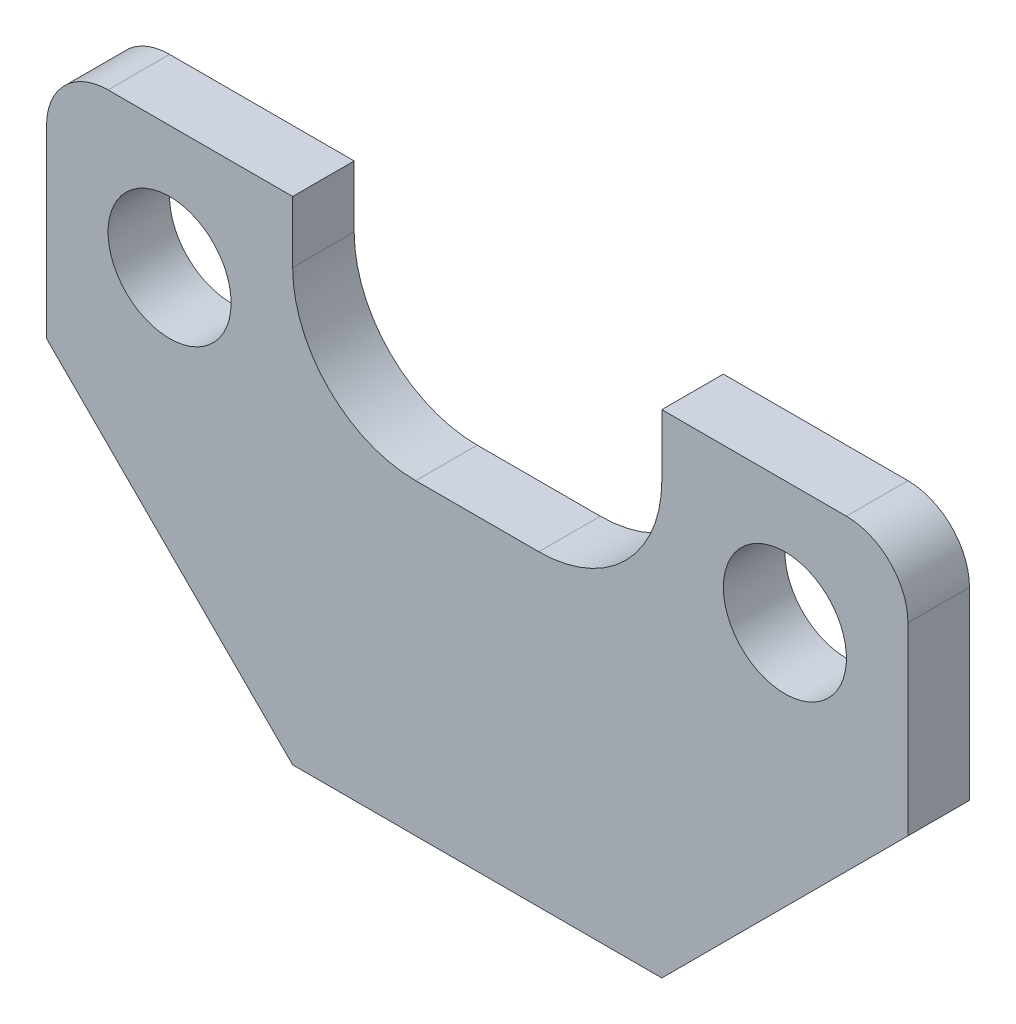
ISO-10303-21;
HEADER;
FILE_DESCRIPTION(('STEP AP214'),'2;1');
FILE_NAME('part.step','',(''),(''),'','','');
FILE_SCHEMA(('AUTOMOTIVE_DESIGN { 1 0 10303 214 1 1 1 1 }'));
ENDSEC;
DATA;
#1=APPLICATION_CONTEXT('core data for automotive mechanical design processes');
#2=APPLICATION_PROTOCOL_DEFINITION('international standard','automotive_design',2000,#1);
#3=PRODUCT_CONTEXT('',#1,'mechanical');
#4=PRODUCT('Part','Part','',(#3));
#5=PRODUCT_RELATED_PRODUCT_CATEGORY('part','',(#4));
#6=PRODUCT_DEFINITION_FORMATION('','',#4);
#7=PRODUCT_DEFINITION_CONTEXT('part definition',#1,'design');
#8=PRODUCT_DEFINITION('design','',#6,#7);
#9=PRODUCT_DEFINITION_SHAPE('','',#8);
#10=(LENGTH_UNIT() NAMED_UNIT(*) SI_UNIT(.MILLI.,.METRE.));
#11=(NAMED_UNIT(*) PLANE_ANGLE_UNIT() SI_UNIT($,.RADIAN.));
#12=(NAMED_UNIT(*) SI_UNIT($,.STERADIAN.) SOLID_ANGLE_UNIT());
#13=UNCERTAINTY_MEASURE_WITH_UNIT(LENGTH_MEASURE(1.E-05),#10,'distance_accuracy_value','');
#14=(GEOMETRIC_REPRESENTATION_CONTEXT(3) GLOBAL_UNCERTAINTY_ASSIGNED_CONTEXT((#13)) GLOBAL_UNIT_ASSIGNED_CONTEXT((#10,
#11,#12)) REPRESENTATION_CONTEXT('',''));
#15=CARTESIAN_POINT('',(0.,0.,0.));
#16=DIRECTION('',(0.,0.,1.));
#17=DIRECTION('',(1.,0.,0.));
#18=AXIS2_PLACEMENT_3D('',#15,#16,#17);
#19=CARTESIAN_POINT('',(-30.,35.,5.));
#20=DIRECTION('',(0.,0.,1.));
#21=DIRECTION('',(1.,0.,0.));
#22=AXIS2_PLACEMENT_3D('',#19,#20,#21);
#23=PLANE('',#22);
#24=CARTESIAN_POINT('',(-25.,30.,5.));
#25=DIRECTION('',(0.,0.,1.));
#26=DIRECTION('',(1.,0.,0.));
#27=AXIS2_PLACEMENT_3D('',#24,#25,#26);
#28=CIRCLE('',#27,5.);
#29=CARTESIAN_POINT('',(-20.,30.,5.));
#30=VERTEX_POINT('',#29);
#31=EDGE_CURVE('E174',#30,#30,#28,.T.);
#32=ORIENTED_EDGE('',*,*,#31,.F.);
#33=EDGE_LOOP('',(#32));
#34=FACE_BOUND('',#33,.T.);
#35=DIRECTION('',(0.707106781186548,-0.707106781186547,0.));
#36=VECTOR('',#35,1.);
#37=CARTESIAN_POINT('',(-15.,0.,5.));
#38=LINE('',#37,#36);
#39=CARTESIAN_POINT('',(-35.,20.,5.));
#40=VERTEX_POINT('',#39);
#41=CARTESIAN_POINT('',(-15.,0.,5.));
#42=VERTEX_POINT('',#41);
#43=EDGE_CURVE('E197',#40,#42,#38,.T.);
#44=ORIENTED_EDGE('',*,*,#43,.T.);
#45=DIRECTION('',(1.,0.,0.));
#46=VECTOR('',#45,1.);
#47=CARTESIAN_POINT('',(15.,0.,5.));
#48=LINE('',#47,#46);
#49=CARTESIAN_POINT('',(15.,0.,5.));
#50=VERTEX_POINT('',#49);
#51=EDGE_CURVE('E115',#42,#50,#48,.T.);
#52=ORIENTED_EDGE('',*,*,#51,.T.);
#53=DIRECTION('',(0.707106781186548,0.707106781186547,0.));
#54=VECTOR('',#53,1.);
#55=CARTESIAN_POINT('',(15.,0.,5.));
#56=LINE('',#55,#54);
#57=CARTESIAN_POINT('',(35.,20.,5.));
#58=VERTEX_POINT('',#57);
#59=EDGE_CURVE('E230',#50,#58,#56,.T.);
#60=ORIENTED_EDGE('',*,*,#59,.T.);
#61=DIRECTION('',(0.,1.,0.));
#62=VECTOR('',#61,1.);
#63=CARTESIAN_POINT('',(35.,20.,5.));
#64=LINE('',#63,#62);
#65=CARTESIAN_POINT('',(35.,35.,5.));
#66=VERTEX_POINT('',#65);
#67=EDGE_CURVE('E249',#58,#66,#64,.T.);
#68=ORIENTED_EDGE('',*,*,#67,.T.);
#69=CARTESIAN_POINT('',(30.,35.,5.));
#70=DIRECTION('',(0.,0.,1.));
#71=DIRECTION('',(-1.,0.,0.));
#72=AXIS2_PLACEMENT_3D('',#69,#70,#71);
#73=CIRCLE('',#72,5.);
#74=CARTESIAN_POINT('',(30.,40.,5.));
#75=VERTEX_POINT('',#74);
#76=EDGE_CURVE('E246',#66,#75,#73,.T.);
#77=ORIENTED_EDGE('',*,*,#76,.T.);
#78=DIRECTION('',(-1.,0.,0.));
#79=VECTOR('',#78,1.);
#80=CARTESIAN_POINT('',(30.,40.,5.));
#81=LINE('',#80,#79);
#82=CARTESIAN_POINT('',(15.,40.,5.));
#83=VERTEX_POINT('',#82);
#84=EDGE_CURVE('E248',#75,#83,#81,.T.);
#85=ORIENTED_EDGE('',*,*,#84,.T.);
#86=DIRECTION('',(0.,-1.,0.));
#87=VECTOR('',#86,1.);
#88=CARTESIAN_POINT('',(15.,40.,5.));
#89=LINE('',#88,#87);
#90=CARTESIAN_POINT('',(15.,35.,5.));
#91=VERTEX_POINT('',#90);
#92=EDGE_CURVE('E251',#83,#91,#89,.T.);
#93=ORIENTED_EDGE('',*,*,#92,.T.);
#94=CARTESIAN_POINT('',(5.,35.,5.));
#95=DIRECTION('',(0.,0.,-1.));
#96=DIRECTION('',(-1.,0.,0.));
#97=AXIS2_PLACEMENT_3D('',#94,#95,#96);
#98=CIRCLE('',#97,10.);
#99=CARTESIAN_POINT('',(5.,25.,5.));
#100=VERTEX_POINT('',#99);
#101=EDGE_CURVE('E257',#91,#100,#98,.T.);
#102=ORIENTED_EDGE('',*,*,#101,.T.);
#103=DIRECTION('',(-1.,0.,0.));
#104=VECTOR('',#103,1.);
#105=CARTESIAN_POINT('',(-5.,25.,5.));
#106=LINE('',#105,#104);
#107=CARTESIAN_POINT('',(-5.,25.,5.));
#108=VERTEX_POINT('',#107);
#109=EDGE_CURVE('E259',#100,#108,#106,.T.);
#110=ORIENTED_EDGE('',*,*,#109,.T.);
#111=CARTESIAN_POINT('',(-5.,35.,5.));
#112=DIRECTION('',(0.,0.,-1.));
#113=DIRECTION('',(1.,0.,0.));
#114=AXIS2_PLACEMENT_3D('',#111,#112,#113);
#115=CIRCLE('',#114,10.);
#116=CARTESIAN_POINT('',(-15.,35.,5.));
#117=VERTEX_POINT('',#116);
#118=EDGE_CURVE('E261',#108,#117,#115,.T.);
#119=ORIENTED_EDGE('',*,*,#118,.T.);
#120=DIRECTION('',(0.,1.,0.));
#121=VECTOR('',#120,1.);
#122=CARTESIAN_POINT('',(-15.,40.,5.));
#123=LINE('',#122,#121);
#124=CARTESIAN_POINT('',(-15.,40.,5.));
#125=VERTEX_POINT('',#124);
#126=EDGE_CURVE('E152',#117,#125,#123,.T.);
#127=ORIENTED_EDGE('',*,*,#126,.T.);
#128=DIRECTION('',(-1.,0.,0.));
#129=VECTOR('',#128,1.);
#130=CARTESIAN_POINT('',(-30.,40.,5.));
#131=LINE('',#130,#129);
#132=CARTESIAN_POINT('',(-30.,40.,5.));
#133=VERTEX_POINT('',#132);
#134=EDGE_CURVE('E146',#125,#133,#131,.T.);
#135=ORIENTED_EDGE('',*,*,#134,.T.);
#136=CARTESIAN_POINT('',(-30.,35.,5.));
#137=DIRECTION('',(0.,0.,1.));
#138=DIRECTION('',(1.,0.,0.));
#139=AXIS2_PLACEMENT_3D('',#136,#137,#138);
#140=CIRCLE('',#139,5.);
#141=CARTESIAN_POINT('',(-35.,35.,5.));
#142=VERTEX_POINT('',#141);
#143=EDGE_CURVE('E150',#133,#142,#140,.T.);
#144=ORIENTED_EDGE('',*,*,#143,.T.);
#145=DIRECTION('',(0.,-1.,0.));
#146=VECTOR('',#145,1.);
#147=CARTESIAN_POINT('',(-35.,20.,5.));
#148=LINE('',#147,#146);
#149=EDGE_CURVE('E54',#142,#40,#148,.T.);
#150=ORIENTED_EDGE('',*,*,#149,.T.);
#151=EDGE_LOOP('',(#44,#52,#60,#68,#77,#85,#93,#102,#110,#119,#127,#135,#144,#150));
#152=FACE_BOUND('',#151,.T.);
#153=CARTESIAN_POINT('',(25.,30.,5.));
#154=DIRECTION('',(0.,0.,1.));
#155=DIRECTION('',(-1.,0.,0.));
#156=AXIS2_PLACEMENT_3D('',#153,#154,#155);
#157=CIRCLE('',#156,5.);
#158=CARTESIAN_POINT('',(20.,30.,5.));
#159=VERTEX_POINT('',#158);
#160=EDGE_CURVE('E303',#159,#159,#157,.T.);
#161=ORIENTED_EDGE('',*,*,#160,.F.);
#162=EDGE_LOOP('',(#161));
#163=FACE_BOUND('',#162,.T.);
#164=ADVANCED_FACE('F37',(#34,#152,#163),#23,.T.);
#165=CARTESIAN_POINT('',(-30.,35.,0.));
#166=DIRECTION('',(0.,0.,1.));
#167=DIRECTION('',(1.,0.,0.));
#168=AXIS2_PLACEMENT_3D('',#165,#166,#167);
#169=PLANE('',#168);
#170=DIRECTION('',(0.707106781186548,-0.707106781186547,0.));
#171=VECTOR('',#170,1.);
#172=CARTESIAN_POINT('',(-15.,0.,0.));
#173=LINE('',#172,#171);
#174=CARTESIAN_POINT('',(-35.,20.,0.));
#175=VERTEX_POINT('',#174);
#176=CARTESIAN_POINT('',(-15.,0.,0.));
#177=VERTEX_POINT('',#176);
#178=EDGE_CURVE('E170',#175,#177,#173,.T.);
#179=ORIENTED_EDGE('',*,*,#178,.F.);
#180=DIRECTION('',(0.,-1.,0.));
#181=VECTOR('',#180,1.);
#182=CARTESIAN_POINT('',(-35.,20.,0.));
#183=LINE('',#182,#181);
#184=CARTESIAN_POINT('',(-35.,35.,0.));
#185=VERTEX_POINT('',#184);
#186=EDGE_CURVE('E107',#185,#175,#183,.T.);
#187=ORIENTED_EDGE('',*,*,#186,.F.);
#188=CARTESIAN_POINT('',(-30.,35.,0.));
#189=DIRECTION('',(0.,0.,1.));
#190=DIRECTION('',(1.,0.,0.));
#191=AXIS2_PLACEMENT_3D('',#188,#189,#190);
#192=CIRCLE('',#191,5.);
#193=CARTESIAN_POINT('',(-30.,40.,0.));
#194=VERTEX_POINT('',#193);
#195=EDGE_CURVE('E101',#194,#185,#192,.T.);
#196=ORIENTED_EDGE('',*,*,#195,.F.);
#197=DIRECTION('',(-1.,0.,0.));
#198=VECTOR('',#197,1.);
#199=CARTESIAN_POINT('',(-30.,40.,0.));
#200=LINE('',#199,#198);
#201=CARTESIAN_POINT('',(-15.,40.,0.));
#202=VERTEX_POINT('',#201);
#203=EDGE_CURVE('E160',#202,#194,#200,.T.);
#204=ORIENTED_EDGE('',*,*,#203,.F.);
#205=DIRECTION('',(0.,1.,0.));
#206=VECTOR('',#205,1.);
#207=CARTESIAN_POINT('',(-15.,40.,0.));
#208=LINE('',#207,#206);
#209=CARTESIAN_POINT('',(-15.,35.,0.));
#210=VERTEX_POINT('',#209);
#211=EDGE_CURVE('E192',#210,#202,#208,.T.);
#212=ORIENTED_EDGE('',*,*,#211,.F.);
#213=CARTESIAN_POINT('',(-5.,35.,0.));
#214=DIRECTION('',(0.,0.,-1.));
#215=DIRECTION('',(1.,0.,0.));
#216=AXIS2_PLACEMENT_3D('',#213,#214,#215);
#217=CIRCLE('',#216,10.);
#218=CARTESIAN_POINT('',(-5.,25.,0.));
#219=VERTEX_POINT('',#218);
#220=EDGE_CURVE('E190',#219,#210,#217,.T.);
#221=ORIENTED_EDGE('',*,*,#220,.F.);
#222=DIRECTION('',(-1.,0.,0.));
#223=VECTOR('',#222,1.);
#224=CARTESIAN_POINT('',(-5.,25.,0.));
#225=LINE('',#224,#223);
#226=CARTESIAN_POINT('',(5.,25.,0.));
#227=VERTEX_POINT('',#226);
#228=EDGE_CURVE('E188',#227,#219,#225,.T.);
#229=ORIENTED_EDGE('',*,*,#228,.F.);
#230=CARTESIAN_POINT('',(5.,35.,0.));
#231=DIRECTION('',(0.,0.,-1.));
#232=DIRECTION('',(-1.,0.,0.));
#233=AXIS2_PLACEMENT_3D('',#230,#231,#232);
#234=CIRCLE('',#233,10.);
#235=CARTESIAN_POINT('',(15.,35.,0.));
#236=VERTEX_POINT('',#235);
#237=EDGE_CURVE('E186',#236,#227,#234,.T.);
#238=ORIENTED_EDGE('',*,*,#237,.F.);
#239=DIRECTION('',(0.,-1.,0.));
#240=VECTOR('',#239,1.);
#241=CARTESIAN_POINT('',(15.,40.,0.));
#242=LINE('',#241,#240);
#243=CARTESIAN_POINT('',(15.,40.,0.));
#244=VERTEX_POINT('',#243);
#245=EDGE_CURVE('E184',#244,#236,#242,.T.);
#246=ORIENTED_EDGE('',*,*,#245,.F.);
#247=DIRECTION('',(-1.,0.,0.));
#248=VECTOR('',#247,1.);
#249=CARTESIAN_POINT('',(30.,40.,0.));
#250=LINE('',#249,#248);
#251=CARTESIAN_POINT('',(30.,40.,0.));
#252=VERTEX_POINT('',#251);
#253=EDGE_CURVE('E182',#252,#244,#250,.T.);
#254=ORIENTED_EDGE('',*,*,#253,.F.);
#255=CARTESIAN_POINT('',(30.,35.,0.));
#256=DIRECTION('',(0.,0.,1.));
#257=DIRECTION('',(-1.,0.,0.));
#258=AXIS2_PLACEMENT_3D('',#255,#256,#257);
#259=CIRCLE('',#258,5.);
#260=CARTESIAN_POINT('',(35.,35.,0.));
#261=VERTEX_POINT('',#260);
#262=EDGE_CURVE('E180',#261,#252,#259,.T.);
#263=ORIENTED_EDGE('',*,*,#262,.F.);
#264=DIRECTION('',(0.,1.,0.));
#265=VECTOR('',#264,1.);
#266=CARTESIAN_POINT('',(35.,20.,0.));
#267=LINE('',#266,#265);
#268=CARTESIAN_POINT('',(35.,20.,0.));
#269=VERTEX_POINT('',#268);
#270=EDGE_CURVE('E178',#269,#261,#267,.T.);
#271=ORIENTED_EDGE('',*,*,#270,.F.);
#272=DIRECTION('',(0.707106781186548,0.707106781186547,0.));
#273=VECTOR('',#272,1.);
#274=CARTESIAN_POINT('',(15.,0.,0.));
#275=LINE('',#274,#273);
#276=CARTESIAN_POINT('',(15.,0.,0.));
#277=VERTEX_POINT('',#276);
#278=EDGE_CURVE('E176',#277,#269,#275,.T.);
#279=ORIENTED_EDGE('',*,*,#278,.F.);
#280=DIRECTION('',(1.,0.,0.));
#281=VECTOR('',#280,1.);
#282=CARTESIAN_POINT('',(15.,0.,0.));
#283=LINE('',#282,#281);
#284=EDGE_CURVE('E173',#177,#277,#283,.T.);
#285=ORIENTED_EDGE('',*,*,#284,.F.);
#286=EDGE_LOOP('',(#179,#187,#196,#204,#212,#221,#229,#238,#246,#254,#263,#271,#279,#285));
#287=FACE_BOUND('',#286,.T.);
#288=CARTESIAN_POINT('',(-25.,30.,0.));
#289=DIRECTION('',(0.,0.,1.));
#290=DIRECTION('',(1.,0.,0.));
#291=AXIS2_PLACEMENT_3D('',#288,#289,#290);
#292=CIRCLE('',#291,5.);
#293=CARTESIAN_POINT('',(-20.,30.,0.));
#294=VERTEX_POINT('',#293);
#295=EDGE_CURVE('E309',#294,#294,#292,.T.);
#296=ORIENTED_EDGE('',*,*,#295,.T.);
#297=EDGE_LOOP('',(#296));
#298=FACE_BOUND('',#297,.T.);
#299=CARTESIAN_POINT('',(25.,30.,0.));
#300=DIRECTION('',(0.,0.,1.));
#301=DIRECTION('',(-1.,0.,0.));
#302=AXIS2_PLACEMENT_3D('',#299,#300,#301);
#303=CIRCLE('',#302,5.);
#304=CARTESIAN_POINT('',(20.,30.,0.));
#305=VERTEX_POINT('',#304);
#306=EDGE_CURVE('E306',#305,#305,#303,.T.);
#307=ORIENTED_EDGE('',*,*,#306,.T.);
#308=EDGE_LOOP('',(#307));
#309=FACE_BOUND('',#308,.T.);
#310=ADVANCED_FACE('F234',(#287,#298,#309),#169,.F.);
#311=CARTESIAN_POINT('',(-15.,0.,5.));
#312=DIRECTION('',(0.707106781186547,0.707106781186548,0.));
#313=DIRECTION('',(-0.707106781186548,0.707106781186547,0.));
#314=AXIS2_PLACEMENT_3D('',#311,#312,#313);
#315=PLANE('',#314);
#316=ORIENTED_EDGE('',*,*,#178,.T.);
#317=DIRECTION('',(0.,0.,-1.));
#318=VECTOR('',#317,1.);
#319=CARTESIAN_POINT('',(-15.,0.,5.));
#320=LINE('',#319,#318);
#321=EDGE_CURVE('E11',#42,#177,#320,.T.);
#322=ORIENTED_EDGE('',*,*,#321,.F.);
#323=ORIENTED_EDGE('',*,*,#43,.F.);
#324=DIRECTION('',(0.,0.,-1.));
#325=VECTOR('',#324,1.);
#326=CARTESIAN_POINT('',(-35.,20.,5.));
#327=LINE('',#326,#325);
#328=EDGE_CURVE('E166',#40,#175,#327,.T.);
#329=ORIENTED_EDGE('',*,*,#328,.T.);
#330=EDGE_LOOP('',(#316,#322,#323,#329));
#331=FACE_BOUND('',#330,.T.);
#332=ADVANCED_FACE('F39',(#331),#315,.F.);
#333=CARTESIAN_POINT('',(15.,0.,5.));
#334=DIRECTION('',(0.,1.,0.));
#335=DIRECTION('',(0.,0.,1.));
#336=AXIS2_PLACEMENT_3D('',#333,#334,#335);
#337=PLANE('',#336);
#338=ORIENTED_EDGE('',*,*,#284,.T.);
#339=DIRECTION('',(0.,0.,-1.));
#340=VECTOR('',#339,1.);
#341=CARTESIAN_POINT('',(15.,0.,5.));
#342=LINE('',#341,#340);
#343=EDGE_CURVE('E46',#50,#277,#342,.T.);
#344=ORIENTED_EDGE('',*,*,#343,.F.);
#345=ORIENTED_EDGE('',*,*,#51,.F.);
#346=ORIENTED_EDGE('',*,*,#321,.T.);
#347=EDGE_LOOP('',(#338,#344,#345,#346));
#348=FACE_BOUND('',#347,.T.);
#349=ADVANCED_FACE('F434',(#348),#337,.F.);
#350=CARTESIAN_POINT('',(15.,0.,5.));
#351=DIRECTION('',(-0.707106781186547,0.707106781186548,0.));
#352=DIRECTION('',(-0.707106781186548,-0.707106781186547,0.));
#353=AXIS2_PLACEMENT_3D('',#350,#351,#352);
#354=PLANE('',#353);
#355=ORIENTED_EDGE('',*,*,#278,.T.);
#356=DIRECTION('',(0.,0.,-1.));
#357=VECTOR('',#356,1.);
#358=CARTESIAN_POINT('',(35.,20.,5.));
#359=LINE('',#358,#357);
#360=EDGE_CURVE('E222',#58,#269,#359,.T.);
#361=ORIENTED_EDGE('',*,*,#360,.F.);
#362=ORIENTED_EDGE('',*,*,#59,.F.);
#363=ORIENTED_EDGE('',*,*,#343,.T.);
#364=EDGE_LOOP('',(#355,#361,#362,#363));
#365=FACE_BOUND('',#364,.T.);
#366=ADVANCED_FACE('F228',(#365),#354,.F.);
#367=CARTESIAN_POINT('',(35.,20.,5.));
#368=DIRECTION('',(-1.,0.,0.));
#369=DIRECTION('',(0.,0.,1.));
#370=AXIS2_PLACEMENT_3D('',#367,#368,#369);
#371=PLANE('',#370);
#372=ORIENTED_EDGE('',*,*,#270,.T.);
#373=DIRECTION('',(0.,0.,-1.));
#374=VECTOR('',#373,1.);
#375=CARTESIAN_POINT('',(35.,35.,5.));
#376=LINE('',#375,#374);
#377=EDGE_CURVE('E219',#66,#261,#376,.T.);
#378=ORIENTED_EDGE('',*,*,#377,.F.);
#379=ORIENTED_EDGE('',*,*,#67,.F.);
#380=ORIENTED_EDGE('',*,*,#360,.T.);
#381=EDGE_LOOP('',(#372,#378,#379,#380));
#382=FACE_BOUND('',#381,.T.);
#383=ADVANCED_FACE('F240',(#382),#371,.F.);
#384=CARTESIAN_POINT('',(30.,35.,5.));
#385=DIRECTION('',(0.,0.,-1.));
#386=DIRECTION('',(-1.,0.,0.));
#387=AXIS2_PLACEMENT_3D('',#384,#385,#386);
#388=CYLINDRICAL_SURFACE('',#387,5.);
#389=ORIENTED_EDGE('',*,*,#262,.T.);
#390=DIRECTION('',(0.,0.,-1.));
#391=VECTOR('',#390,1.);
#392=CARTESIAN_POINT('',(30.,40.,5.));
#393=LINE('',#392,#391);
#394=EDGE_CURVE('E216',#75,#252,#393,.T.);
#395=ORIENTED_EDGE('',*,*,#394,.F.);
#396=ORIENTED_EDGE('',*,*,#76,.F.);
#397=ORIENTED_EDGE('',*,*,#377,.T.);
#398=EDGE_LOOP('',(#389,#395,#396,#397));
#399=FACE_BOUND('',#398,.T.);
#400=ADVANCED_FACE('F244',(#399),#388,.T.);
#401=CARTESIAN_POINT('',(30.,40.,5.));
#402=DIRECTION('',(0.,-1.,0.));
#403=DIRECTION('',(1.,0.,0.));
#404=AXIS2_PLACEMENT_3D('',#401,#402,#403);
#405=PLANE('',#404);
#406=ORIENTED_EDGE('',*,*,#253,.T.);
#407=DIRECTION('',(0.,0.,-1.));
#408=VECTOR('',#407,1.);
#409=CARTESIAN_POINT('',(15.,40.,5.));
#410=LINE('',#409,#408);
#411=EDGE_CURVE('E213',#83,#244,#410,.T.);
#412=ORIENTED_EDGE('',*,*,#411,.F.);
#413=ORIENTED_EDGE('',*,*,#84,.F.);
#414=ORIENTED_EDGE('',*,*,#394,.T.);
#415=EDGE_LOOP('',(#406,#412,#413,#414));
#416=FACE_BOUND('',#415,.T.);
#417=ADVANCED_FACE('F395',(#416),#405,.F.);
#418=CARTESIAN_POINT('',(15.,40.,5.));
#419=DIRECTION('',(1.,0.,0.));
#420=DIRECTION('',(0.,0.,-1.));
#421=AXIS2_PLACEMENT_3D('',#418,#419,#420);
#422=PLANE('',#421);
#423=ORIENTED_EDGE('',*,*,#245,.T.);
#424=DIRECTION('',(0.,0.,-1.));
#425=VECTOR('',#424,1.);
#426=CARTESIAN_POINT('',(15.,35.,5.));
#427=LINE('',#426,#425);
#428=EDGE_CURVE('E210',#91,#236,#427,.T.);
#429=ORIENTED_EDGE('',*,*,#428,.F.);
#430=ORIENTED_EDGE('',*,*,#92,.F.);
#431=ORIENTED_EDGE('',*,*,#411,.T.);
#432=EDGE_LOOP('',(#423,#429,#430,#431));
#433=FACE_BOUND('',#432,.T.);
#434=ADVANCED_FACE('F384',(#433),#422,.F.);
#435=CARTESIAN_POINT('',(5.,35.,5.));
#436=DIRECTION('',(0.,0.,-1.));
#437=DIRECTION('',(-1.,0.,0.));
#438=AXIS2_PLACEMENT_3D('',#435,#436,#437);
#439=CYLINDRICAL_SURFACE('',#438,10.);
#440=ORIENTED_EDGE('',*,*,#237,.T.);
#441=DIRECTION('',(0.,0.,-1.));
#442=VECTOR('',#441,1.);
#443=CARTESIAN_POINT('',(5.,25.,5.));
#444=LINE('',#443,#442);
#445=EDGE_CURVE('E207',#100,#227,#444,.T.);
#446=ORIENTED_EDGE('',*,*,#445,.F.);
#447=ORIENTED_EDGE('',*,*,#101,.F.);
#448=ORIENTED_EDGE('',*,*,#428,.T.);
#449=EDGE_LOOP('',(#440,#446,#447,#448));
#450=FACE_BOUND('',#449,.T.);
#451=ADVANCED_FACE('F373',(#450),#439,.F.);
#452=CARTESIAN_POINT('',(-5.,25.,5.));
#453=DIRECTION('',(0.,-1.,0.));
#454=DIRECTION('',(0.,0.,-1.));
#455=AXIS2_PLACEMENT_3D('',#452,#453,#454);
#456=PLANE('',#455);
#457=ORIENTED_EDGE('',*,*,#228,.T.);
#458=DIRECTION('',(0.,0.,-1.));
#459=VECTOR('',#458,1.);
#460=CARTESIAN_POINT('',(-5.,25.,5.));
#461=LINE('',#460,#459);
#462=EDGE_CURVE('E204',#108,#219,#461,.T.);
#463=ORIENTED_EDGE('',*,*,#462,.F.);
#464=ORIENTED_EDGE('',*,*,#109,.F.);
#465=ORIENTED_EDGE('',*,*,#445,.T.);
#466=EDGE_LOOP('',(#457,#463,#464,#465));
#467=FACE_BOUND('',#466,.T.);
#468=ADVANCED_FACE('F363',(#467),#456,.F.);
#469=CARTESIAN_POINT('',(-5.,35.,5.));
#470=DIRECTION('',(0.,0.,-1.));
#471=DIRECTION('',(-1.,0.,0.));
#472=AXIS2_PLACEMENT_3D('',#469,#470,#471);
#473=CYLINDRICAL_SURFACE('',#472,10.);
#474=ORIENTED_EDGE('',*,*,#220,.T.);
#475=DIRECTION('',(0.,0.,-1.));
#476=VECTOR('',#475,1.);
#477=CARTESIAN_POINT('',(-15.,35.,5.));
#478=LINE('',#477,#476);
#479=EDGE_CURVE('E201',#117,#210,#478,.T.);
#480=ORIENTED_EDGE('',*,*,#479,.F.);
#481=ORIENTED_EDGE('',*,*,#118,.F.);
#482=ORIENTED_EDGE('',*,*,#462,.T.);
#483=EDGE_LOOP('',(#474,#480,#481,#482));
#484=FACE_BOUND('',#483,.T.);
#485=ADVANCED_FACE('F267',(#484),#473,.F.);
#486=CARTESIAN_POINT('',(-15.,40.,5.));
#487=DIRECTION('',(-1.,0.,0.));
#488=DIRECTION('',(0.,0.,1.));
#489=AXIS2_PLACEMENT_3D('',#486,#487,#488);
#490=PLANE('',#489);
#491=ORIENTED_EDGE('',*,*,#211,.T.);
#492=DIRECTION('',(0.,0.,-1.));
#493=VECTOR('',#492,1.);
#494=CARTESIAN_POINT('',(-15.,40.,5.));
#495=LINE('',#494,#493);
#496=EDGE_CURVE('E161',#125,#202,#495,.T.);
#497=ORIENTED_EDGE('',*,*,#496,.F.);
#498=ORIENTED_EDGE('',*,*,#126,.F.);
#499=ORIENTED_EDGE('',*,*,#479,.T.);
#500=EDGE_LOOP('',(#491,#497,#498,#499));
#501=FACE_BOUND('',#500,.T.);
#502=ADVANCED_FACE('F271',(#501),#490,.F.);
#503=CARTESIAN_POINT('',(-30.,40.,5.));
#504=DIRECTION('',(0.,-1.,0.));
#505=DIRECTION('',(1.,0.,0.));
#506=AXIS2_PLACEMENT_3D('',#503,#504,#505);
#507=PLANE('',#506);
#508=ORIENTED_EDGE('',*,*,#203,.T.);
#509=DIRECTION('',(0.,0.,-1.));
#510=VECTOR('',#509,1.);
#511=CARTESIAN_POINT('',(-30.,40.,5.));
#512=LINE('',#511,#510);
#513=EDGE_CURVE('E157',#133,#194,#512,.T.);
#514=ORIENTED_EDGE('',*,*,#513,.F.);
#515=ORIENTED_EDGE('',*,*,#134,.F.);
#516=ORIENTED_EDGE('',*,*,#496,.T.);
#517=EDGE_LOOP('',(#508,#514,#515,#516));
#518=FACE_BOUND('',#517,.T.);
#519=ADVANCED_FACE('F158',(#518),#507,.F.);
#520=CARTESIAN_POINT('',(-30.,35.,5.));
#521=DIRECTION('',(0.,0.,-1.));
#522=DIRECTION('',(-1.,0.,0.));
#523=AXIS2_PLACEMENT_3D('',#520,#521,#522);
#524=CYLINDRICAL_SURFACE('',#523,5.);
#525=ORIENTED_EDGE('',*,*,#195,.T.);
#526=DIRECTION('',(0.,0.,-1.));
#527=VECTOR('',#526,1.);
#528=CARTESIAN_POINT('',(-35.,35.,5.));
#529=LINE('',#528,#527);
#530=EDGE_CURVE('E162',#142,#185,#529,.T.);
#531=ORIENTED_EDGE('',*,*,#530,.F.);
#532=ORIENTED_EDGE('',*,*,#143,.F.);
#533=ORIENTED_EDGE('',*,*,#513,.T.);
#534=EDGE_LOOP('',(#525,#531,#532,#533));
#535=FACE_BOUND('',#534,.T.);
#536=ADVANCED_FACE('F164',(#535),#524,.T.);
#537=CARTESIAN_POINT('',(-35.,20.,5.));
#538=DIRECTION('',(1.,0.,0.));
#539=DIRECTION('',(0.,0.,-1.));
#540=AXIS2_PLACEMENT_3D('',#537,#538,#539);
#541=PLANE('',#540);
#542=ORIENTED_EDGE('',*,*,#186,.T.);
#543=ORIENTED_EDGE('',*,*,#328,.F.);
#544=ORIENTED_EDGE('',*,*,#149,.F.);
#545=ORIENTED_EDGE('',*,*,#530,.T.);
#546=EDGE_LOOP('',(#542,#543,#544,#545));
#547=FACE_BOUND('',#546,.T.);
#548=ADVANCED_FACE('F275',(#547),#541,.F.);
#549=CARTESIAN_POINT('',(-25.,30.,5.));
#550=DIRECTION('',(0.,0.,-1.));
#551=DIRECTION('',(-1.,0.,0.));
#552=AXIS2_PLACEMENT_3D('',#549,#550,#551);
#553=CYLINDRICAL_SURFACE('',#552,5.);
#554=ORIENTED_EDGE('',*,*,#31,.T.);
#555=EDGE_LOOP('',(#554));
#556=FACE_BOUND('',#555,.T.);
#557=ORIENTED_EDGE('',*,*,#295,.F.);
#558=EDGE_LOOP('',(#557));
#559=FACE_BOUND('',#558,.T.);
#560=ADVANCED_FACE('F277',(#556,#559),#553,.F.);
#561=CARTESIAN_POINT('',(25.,30.,5.));
#562=DIRECTION('',(0.,0.,-1.));
#563=DIRECTION('',(-1.,0.,0.));
#564=AXIS2_PLACEMENT_3D('',#561,#562,#563);
#565=CYLINDRICAL_SURFACE('',#564,5.);
#566=ORIENTED_EDGE('',*,*,#160,.T.);
#567=EDGE_LOOP('',(#566));
#568=FACE_BOUND('',#567,.T.);
#569=ORIENTED_EDGE('',*,*,#306,.F.);
#570=EDGE_LOOP('',(#569));
#571=FACE_BOUND('',#570,.T.);
#572=ADVANCED_FACE('F283',(#568,#571),#565,.F.);
#573=CLOSED_SHELL('',(#164,#310,#332,#349,#366,#383,#400,#417,#434,#451,#468,#485,#502,#519,
#536,#548,#560,#572));
#574=MANIFOLD_SOLID_BREP('B2',#573);
#575=ADVANCED_BREP_SHAPE_REPRESENTATION('',(#18,#574),#14);
#576=SHAPE_DEFINITION_REPRESENTATION(#9,#575);
ENDSEC;
END-ISO-10303-21;
